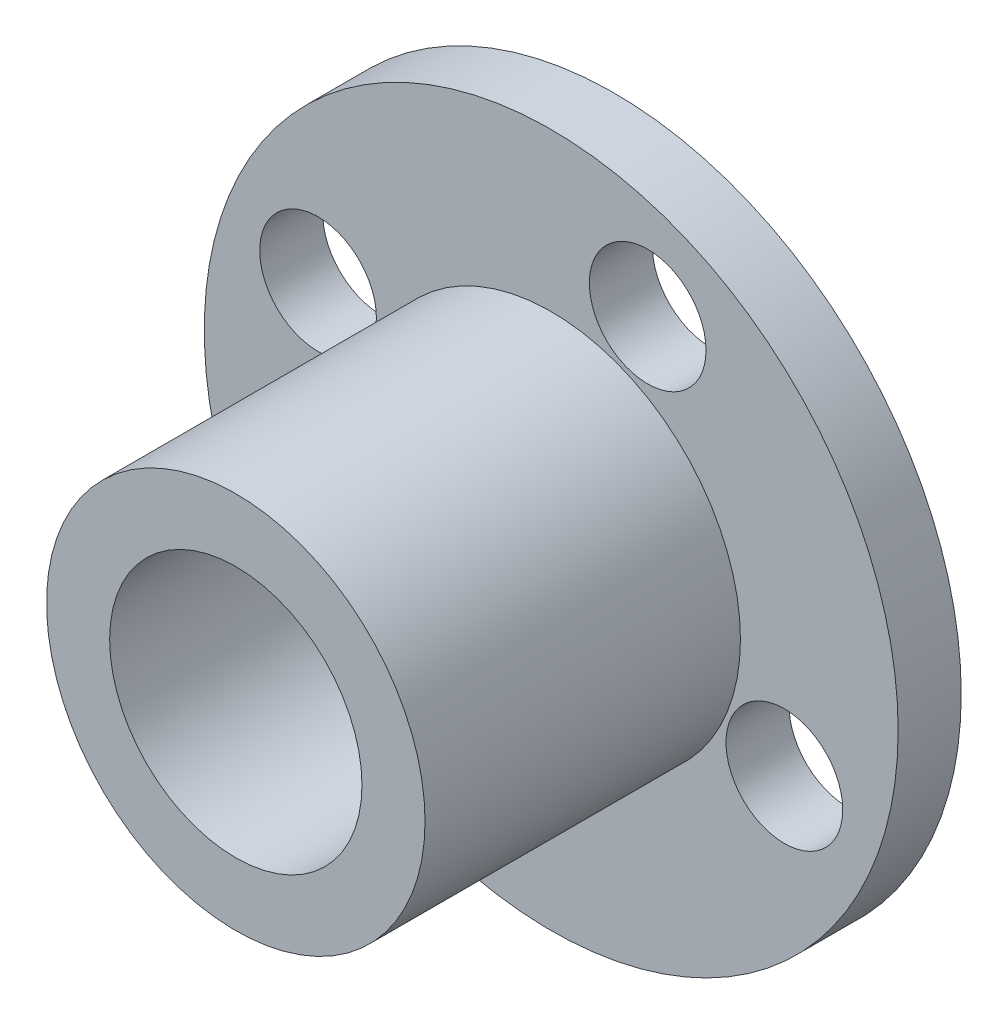
ISO-10303-21;
HEADER;
FILE_DESCRIPTION(('STEP AP214'),'2;1');
FILE_NAME('part.step','',(''),(''),'','','');
FILE_SCHEMA(('AUTOMOTIVE_DESIGN { 1 0 10303 214 1 1 1 1 }'));
ENDSEC;
DATA;
#1=APPLICATION_CONTEXT('core data for automotive mechanical design processes');
#2=APPLICATION_PROTOCOL_DEFINITION('international standard','automotive_design',2000,#1);
#3=PRODUCT_CONTEXT('',#1,'mechanical');
#4=PRODUCT('Part','Part','',(#3));
#5=PRODUCT_RELATED_PRODUCT_CATEGORY('part','',(#4));
#6=PRODUCT_DEFINITION_FORMATION('','',#4);
#7=PRODUCT_DEFINITION_CONTEXT('part definition',#1,'design');
#8=PRODUCT_DEFINITION('design','',#6,#7);
#9=PRODUCT_DEFINITION_SHAPE('','',#8);
#10=(LENGTH_UNIT() NAMED_UNIT(*) SI_UNIT(.MILLI.,.METRE.));
#11=(NAMED_UNIT(*) PLANE_ANGLE_UNIT() SI_UNIT($,.RADIAN.));
#12=(NAMED_UNIT(*) SI_UNIT($,.STERADIAN.) SOLID_ANGLE_UNIT());
#13=UNCERTAINTY_MEASURE_WITH_UNIT(LENGTH_MEASURE(1.E-05),#10,'distance_accuracy_value','');
#14=(GEOMETRIC_REPRESENTATION_CONTEXT(3) GLOBAL_UNCERTAINTY_ASSIGNED_CONTEXT((#13)) GLOBAL_UNIT_ASSIGNED_CONTEXT((#10,
#11,#12)) REPRESENTATION_CONTEXT('',''));
#15=CARTESIAN_POINT('',(0.,0.,0.));
#16=DIRECTION('',(0.,0.,1.));
#17=DIRECTION('',(1.,0.,0.));
#18=AXIS2_PLACEMENT_3D('',#15,#16,#17);
#19=CARTESIAN_POINT('',(0.,0.,2.));
#20=DIRECTION('',(0.,0.,1.));
#21=DIRECTION('',(1.,0.,0.));
#22=AXIS2_PLACEMENT_3D('',#19,#20,#21);
#23=PLANE('',#22);
#24=CARTESIAN_POINT('',(0.,0.,2.));
#25=DIRECTION('',(0.,0.,1.));
#26=DIRECTION('',(1.,0.,0.));
#27=AXIS2_PLACEMENT_3D('',#24,#25,#26);
#28=CIRCLE('',#27,6.);
#29=CARTESIAN_POINT('',(6.,0.,2.));
#30=VERTEX_POINT('',#29);
#31=EDGE_CURVE('E10',#30,#30,#28,.T.);
#32=ORIENTED_EDGE('',*,*,#31,.F.);
#33=EDGE_LOOP('',(#32));
#34=FACE_BOUND('',#33,.T.);
#35=CARTESIAN_POINT('',(3.05854244052791,7.39224716441386,2.));
#36=DIRECTION('',(0.,0.,1.));
#37=DIRECTION('',(1.,0.,0.));
#38=AXIS2_PLACEMENT_3D('',#35,#36,#37);
#39=CIRCLE('',#38,1.85);
#40=CARTESIAN_POINT('',(4.90854244052791,7.39224716441386,2.));
#41=VERTEX_POINT('',#40);
#42=EDGE_CURVE('E65',#41,#41,#39,.T.);
#43=ORIENTED_EDGE('',*,*,#42,.F.);
#44=EDGE_LOOP('',(#43));
#45=FACE_BOUND('',#44,.T.);
#46=CARTESIAN_POINT('',(-3.05854244052481,-7.39224716437522,2.));
#47=DIRECTION('',(0.,0.,1.));
#48=DIRECTION('',(1.,0.,0.));
#49=AXIS2_PLACEMENT_3D('',#46,#47,#48);
#50=CIRCLE('',#49,1.85);
#51=CARTESIAN_POINT('',(-1.20854244052481,-7.39224716437522,2.));
#52=VERTEX_POINT('',#51);
#53=EDGE_CURVE('E77',#52,#52,#50,.T.);
#54=ORIENTED_EDGE('',*,*,#53,.F.);
#55=EDGE_LOOP('',(#54));
#56=FACE_BOUND('',#55,.T.);
#57=CARTESIAN_POINT('',(0.,0.,2.));
#58=DIRECTION('',(0.,0.,1.));
#59=DIRECTION('',(1.,0.,0.));
#60=AXIS2_PLACEMENT_3D('',#57,#58,#59);
#61=CIRCLE('',#60,11.);
#62=CARTESIAN_POINT('',(11.,0.,2.));
#63=VERTEX_POINT('',#62);
#64=EDGE_CURVE('E47',#63,#63,#61,.T.);
#65=ORIENTED_EDGE('',*,*,#64,.T.);
#66=EDGE_LOOP('',(#65));
#67=FACE_BOUND('',#66,.T.);
#68=CARTESIAN_POINT('',(-7.39224716439302,3.0585424405456,2.));
#69=DIRECTION('',(0.,0.,1.));
#70=DIRECTION('',(1.,0.,0.));
#71=AXIS2_PLACEMENT_3D('',#68,#69,#70);
#72=CIRCLE('',#71,1.85);
#73=CARTESIAN_POINT('',(-5.54224716439302,3.0585424405456,2.));
#74=VERTEX_POINT('',#73);
#75=EDGE_CURVE('E71',#74,#74,#72,.T.);
#76=ORIENTED_EDGE('',*,*,#75,.F.);
#77=EDGE_LOOP('',(#76));
#78=FACE_BOUND('',#77,.T.);
#79=CARTESIAN_POINT('',(7.39224716439612,-3.05854244050696,2.));
#80=DIRECTION('',(0.,0.,1.));
#81=DIRECTION('',(1.,0.,0.));
#82=AXIS2_PLACEMENT_3D('',#79,#80,#81);
#83=CIRCLE('',#82,1.85);
#84=CARTESIAN_POINT('',(9.24224716439612,-3.05854244050696,2.));
#85=VERTEX_POINT('',#84);
#86=EDGE_CURVE('E58',#85,#85,#83,.T.);
#87=ORIENTED_EDGE('',*,*,#86,.F.);
#88=EDGE_LOOP('',(#87));
#89=FACE_BOUND('',#88,.T.);
#90=ADVANCED_FACE('F39',(#34,#45,#56,#67,#78,#89),#23,.T.);
#91=CARTESIAN_POINT('',(0.,0.,0.));
#92=DIRECTION('',(0.,0.,1.));
#93=DIRECTION('',(1.,0.,0.));
#94=AXIS2_PLACEMENT_3D('',#91,#92,#93);
#95=PLANE('',#94);
#96=CARTESIAN_POINT('',(0.,0.,0.));
#97=DIRECTION('',(0.,0.,-1.));
#98=DIRECTION('',(-1.,0.,0.));
#99=AXIS2_PLACEMENT_3D('',#96,#97,#98);
#100=CIRCLE('',#99,4.);
#101=CARTESIAN_POINT('',(-4.,0.,0.));
#102=VERTEX_POINT('',#101);
#103=EDGE_CURVE('E179',#102,#102,#100,.T.);
#104=ORIENTED_EDGE('',*,*,#103,.F.);
#105=EDGE_LOOP('',(#104));
#106=FACE_BOUND('',#105,.T.);
#107=CARTESIAN_POINT('',(0.,0.,0.));
#108=DIRECTION('',(0.,0.,1.));
#109=DIRECTION('',(1.,0.,0.));
#110=AXIS2_PLACEMENT_3D('',#107,#108,#109);
#111=CIRCLE('',#110,11.);
#112=CARTESIAN_POINT('',(11.,0.,0.));
#113=VERTEX_POINT('',#112);
#114=EDGE_CURVE('E52',#113,#113,#111,.T.);
#115=ORIENTED_EDGE('',*,*,#114,.F.);
#116=EDGE_LOOP('',(#115));
#117=FACE_BOUND('',#116,.T.);
#118=CARTESIAN_POINT('',(-3.05854244052481,-7.39224716437522,0.));
#119=DIRECTION('',(0.,0.,1.));
#120=DIRECTION('',(1.,0.,0.));
#121=AXIS2_PLACEMENT_3D('',#118,#119,#120);
#122=CIRCLE('',#121,1.85);
#123=CARTESIAN_POINT('',(-1.20854244052481,-7.39224716437522,0.));
#124=VERTEX_POINT('',#123);
#125=EDGE_CURVE('E74',#124,#124,#122,.T.);
#126=ORIENTED_EDGE('',*,*,#125,.T.);
#127=EDGE_LOOP('',(#126));
#128=FACE_BOUND('',#127,.T.);
#129=CARTESIAN_POINT('',(-7.39224716439302,3.0585424405456,0.));
#130=DIRECTION('',(0.,0.,1.));
#131=DIRECTION('',(1.,0.,0.));
#132=AXIS2_PLACEMENT_3D('',#129,#130,#131);
#133=CIRCLE('',#132,1.85);
#134=CARTESIAN_POINT('',(-5.54224716439302,3.0585424405456,0.));
#135=VERTEX_POINT('',#134);
#136=EDGE_CURVE('E68',#135,#135,#133,.T.);
#137=ORIENTED_EDGE('',*,*,#136,.T.);
#138=EDGE_LOOP('',(#137));
#139=FACE_BOUND('',#138,.T.);
#140=CARTESIAN_POINT('',(3.05854244052791,7.39224716441386,0.));
#141=DIRECTION('',(0.,0.,1.));
#142=DIRECTION('',(1.,0.,0.));
#143=AXIS2_PLACEMENT_3D('',#140,#141,#142);
#144=CIRCLE('',#143,1.85);
#145=CARTESIAN_POINT('',(4.90854244052791,7.39224716441386,0.));
#146=VERTEX_POINT('',#145);
#147=EDGE_CURVE('E61',#146,#146,#144,.T.);
#148=ORIENTED_EDGE('',*,*,#147,.T.);
#149=EDGE_LOOP('',(#148));
#150=FACE_BOUND('',#149,.T.);
#151=CARTESIAN_POINT('',(7.39224716439612,-3.05854244050696,0.));
#152=DIRECTION('',(0.,0.,1.));
#153=DIRECTION('',(1.,0.,0.));
#154=AXIS2_PLACEMENT_3D('',#151,#152,#153);
#155=CIRCLE('',#154,1.85);
#156=CARTESIAN_POINT('',(9.24224716439612,-3.05854244050696,0.));
#157=VERTEX_POINT('',#156);
#158=EDGE_CURVE('E62',#157,#157,#155,.T.);
#159=ORIENTED_EDGE('',*,*,#158,.T.);
#160=EDGE_LOOP('',(#159));
#161=FACE_BOUND('',#160,.T.);
#162=ADVANCED_FACE('F85',(#106,#117,#128,#139,#150,#161),#95,.F.);
#163=CARTESIAN_POINT('',(0.,0.,2.));
#164=DIRECTION('',(0.,0.,-1.));
#165=DIRECTION('',(-1.,0.,0.));
#166=AXIS2_PLACEMENT_3D('',#163,#164,#165);
#167=CYLINDRICAL_SURFACE('',#166,11.);
#168=ORIENTED_EDGE('',*,*,#64,.F.);
#169=EDGE_LOOP('',(#168));
#170=FACE_BOUND('',#169,.T.);
#171=ORIENTED_EDGE('',*,*,#114,.T.);
#172=EDGE_LOOP('',(#171));
#173=FACE_BOUND('',#172,.T.);
#174=ADVANCED_FACE('F41',(#170,#173),#167,.T.);
#175=CARTESIAN_POINT('',(-3.05854244052481,-7.39224716437522,2.));
#176=DIRECTION('',(0.,0.,-1.));
#177=DIRECTION('',(-1.,0.,0.));
#178=AXIS2_PLACEMENT_3D('',#175,#176,#177);
#179=CYLINDRICAL_SURFACE('',#178,1.85);
#180=ORIENTED_EDGE('',*,*,#53,.T.);
#181=EDGE_LOOP('',(#180));
#182=FACE_BOUND('',#181,.T.);
#183=ORIENTED_EDGE('',*,*,#125,.F.);
#184=EDGE_LOOP('',(#183));
#185=FACE_BOUND('',#184,.T.);
#186=ADVANCED_FACE('F120',(#182,#185),#179,.F.);
#187=CARTESIAN_POINT('',(-7.39224716439302,3.0585424405456,2.));
#188=DIRECTION('',(0.,0.,-1.));
#189=DIRECTION('',(-1.,0.,0.));
#190=AXIS2_PLACEMENT_3D('',#187,#188,#189);
#191=CYLINDRICAL_SURFACE('',#190,1.85);
#192=ORIENTED_EDGE('',*,*,#75,.T.);
#193=EDGE_LOOP('',(#192));
#194=FACE_BOUND('',#193,.T.);
#195=ORIENTED_EDGE('',*,*,#136,.F.);
#196=EDGE_LOOP('',(#195));
#197=FACE_BOUND('',#196,.T.);
#198=ADVANCED_FACE('F111',(#194,#197),#191,.F.);
#199=CARTESIAN_POINT('',(3.05854244052791,7.39224716441386,2.));
#200=DIRECTION('',(0.,0.,-1.));
#201=DIRECTION('',(-1.,0.,0.));
#202=AXIS2_PLACEMENT_3D('',#199,#200,#201);
#203=CYLINDRICAL_SURFACE('',#202,1.85);
#204=ORIENTED_EDGE('',*,*,#42,.T.);
#205=EDGE_LOOP('',(#204));
#206=FACE_BOUND('',#205,.T.);
#207=ORIENTED_EDGE('',*,*,#147,.F.);
#208=EDGE_LOOP('',(#207));
#209=FACE_BOUND('',#208,.T.);
#210=ADVANCED_FACE('F100',(#206,#209),#203,.F.);
#211=CARTESIAN_POINT('',(7.39224716439612,-3.05854244050696,2.));
#212=DIRECTION('',(0.,0.,-1.));
#213=DIRECTION('',(-1.,0.,0.));
#214=AXIS2_PLACEMENT_3D('',#211,#212,#213);
#215=CYLINDRICAL_SURFACE('',#214,1.85);
#216=ORIENTED_EDGE('',*,*,#86,.T.);
#217=EDGE_LOOP('',(#216));
#218=FACE_BOUND('',#217,.T.);
#219=ORIENTED_EDGE('',*,*,#158,.F.);
#220=EDGE_LOOP('',(#219));
#221=FACE_BOUND('',#220,.T.);
#222=ADVANCED_FACE('F97',(#218,#221),#215,.F.);
#223=CARTESIAN_POINT('',(0.,0.,12.));
#224=DIRECTION('',(0.,0.,-1.));
#225=DIRECTION('',(-1.,0.,0.));
#226=AXIS2_PLACEMENT_3D('',#223,#224,#225);
#227=CYLINDRICAL_SURFACE('',#226,6.);
#228=CARTESIAN_POINT('',(0.,0.,12.));
#229=DIRECTION('',(0.,0.,1.));
#230=DIRECTION('',(1.,0.,0.));
#231=AXIS2_PLACEMENT_3D('',#228,#229,#230);
#232=CIRCLE('',#231,6.);
#233=CARTESIAN_POINT('',(6.,0.,12.));
#234=VERTEX_POINT('',#233);
#235=EDGE_CURVE('E56',#234,#234,#232,.T.);
#236=ORIENTED_EDGE('',*,*,#235,.F.);
#237=EDGE_LOOP('',(#236));
#238=FACE_BOUND('',#237,.T.);
#239=ORIENTED_EDGE('',*,*,#31,.T.);
#240=EDGE_LOOP('',(#239));
#241=FACE_BOUND('',#240,.T.);
#242=ADVANCED_FACE('F99',(#238,#241),#227,.T.);
#243=CARTESIAN_POINT('',(0.,0.,12.));
#244=DIRECTION('',(0.,0.,1.));
#245=DIRECTION('',(1.,0.,0.));
#246=AXIS2_PLACEMENT_3D('',#243,#244,#245);
#247=PLANE('',#246);
#248=CARTESIAN_POINT('',(0.,0.,12.));
#249=DIRECTION('',(0.,0.,1.));
#250=DIRECTION('',(1.,0.,0.));
#251=AXIS2_PLACEMENT_3D('',#248,#249,#250);
#252=CIRCLE('',#251,4.);
#253=CARTESIAN_POINT('',(4.,0.,12.));
#254=VERTEX_POINT('',#253);
#255=EDGE_CURVE('E43',#254,#254,#252,.T.);
#256=ORIENTED_EDGE('',*,*,#255,.F.);
#257=EDGE_LOOP('',(#256));
#258=FACE_BOUND('',#257,.T.);
#259=ORIENTED_EDGE('',*,*,#235,.T.);
#260=EDGE_LOOP('',(#259));
#261=FACE_BOUND('',#260,.T.);
#262=ADVANCED_FACE('F108',(#258,#261),#247,.T.);
#263=CARTESIAN_POINT('',(0.,0.,15.));
#264=DIRECTION('',(0.,0.,-1.));
#265=DIRECTION('',(-1.,0.,0.));
#266=AXIS2_PLACEMENT_3D('',#263,#264,#265);
#267=CYLINDRICAL_SURFACE('',#266,4.);
#268=ORIENTED_EDGE('',*,*,#255,.T.);
#269=EDGE_LOOP('',(#268));
#270=FACE_BOUND('',#269,.T.);
#271=ORIENTED_EDGE('',*,*,#103,.T.);
#272=EDGE_LOOP('',(#271));
#273=FACE_BOUND('',#272,.T.);
#274=ADVANCED_FACE('F161',(#270,#273),#267,.F.);
#275=CLOSED_SHELL('',(#90,#162,#174,#186,#198,#210,#222,#242,#262,#274));
#276=MANIFOLD_SOLID_BREP('B2',#275);
#277=ADVANCED_BREP_SHAPE_REPRESENTATION('',(#18,#276),#14);
#278=SHAPE_DEFINITION_REPRESENTATION(#9,#277);
ENDSEC;
END-ISO-10303-21;
